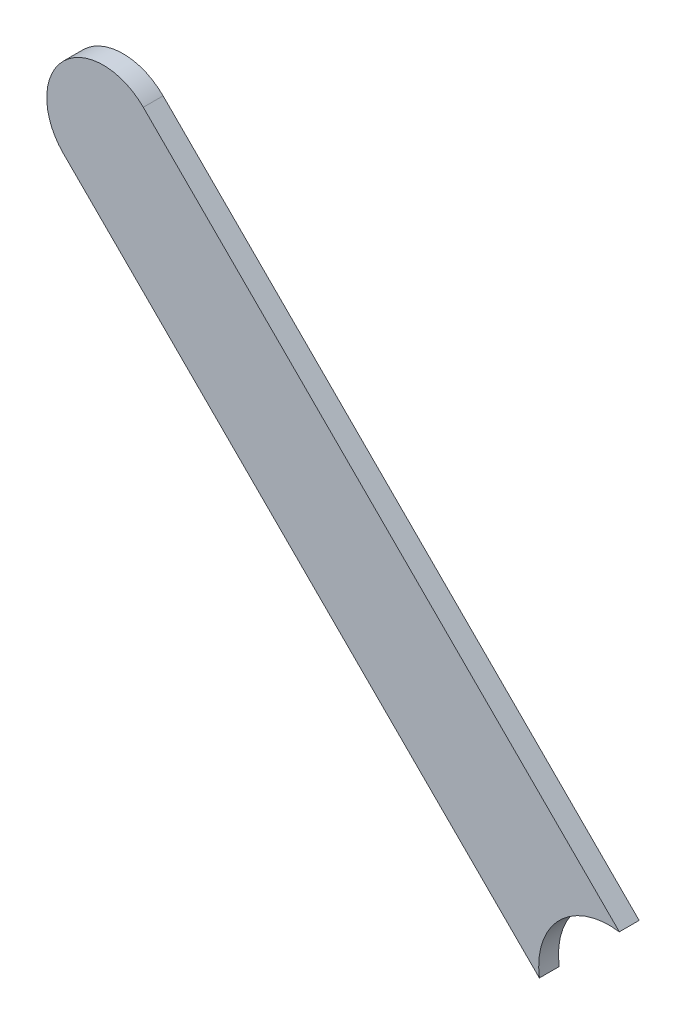
ISO-10303-21;
HEADER;
FILE_DESCRIPTION(('STEP AP214'),'2;1');
FILE_NAME('part.step','',(''),(''),'','','');
FILE_SCHEMA(('AUTOMOTIVE_DESIGN { 1 0 10303 214 1 1 1 1 }'));
ENDSEC;
DATA;
#1=APPLICATION_CONTEXT('core data for automotive mechanical design processes');
#2=APPLICATION_PROTOCOL_DEFINITION('international standard','automotive_design',2000,#1);
#3=PRODUCT_CONTEXT('',#1,'mechanical');
#4=PRODUCT('Part','Part','',(#3));
#5=PRODUCT_RELATED_PRODUCT_CATEGORY('part','',(#4));
#6=PRODUCT_DEFINITION_FORMATION('','',#4);
#7=PRODUCT_DEFINITION_CONTEXT('part definition',#1,'design');
#8=PRODUCT_DEFINITION('design','',#6,#7);
#9=PRODUCT_DEFINITION_SHAPE('','',#8);
#10=(LENGTH_UNIT() NAMED_UNIT(*) SI_UNIT(.MILLI.,.METRE.));
#11=(NAMED_UNIT(*) PLANE_ANGLE_UNIT() SI_UNIT($,.RADIAN.));
#12=(NAMED_UNIT(*) SI_UNIT($,.STERADIAN.) SOLID_ANGLE_UNIT());
#13=UNCERTAINTY_MEASURE_WITH_UNIT(LENGTH_MEASURE(1.E-05),#10,'distance_accuracy_value','');
#14=(GEOMETRIC_REPRESENTATION_CONTEXT(3) GLOBAL_UNCERTAINTY_ASSIGNED_CONTEXT((#13)) GLOBAL_UNIT_ASSIGNED_CONTEXT((#10,
#11,#12)) REPRESENTATION_CONTEXT('',''));
#15=CARTESIAN_POINT('',(0.,0.,0.));
#16=DIRECTION('',(0.,0.,1.));
#17=DIRECTION('',(1.,0.,0.));
#18=AXIS2_PLACEMENT_3D('',#15,#16,#17);
#19=CARTESIAN_POINT('',(94.899137,-127.365685,1.6));
#20=DIRECTION('',(0.707106781186548,0.707106781186548,0.));
#21=DIRECTION('',(0.,0.,-1.));
#22=AXIS2_PLACEMENT_3D('',#19,#20,#21);
#23=PLANE('',#22);
#24=DIRECTION('',(0.,0.,-1.));
#25=VECTOR('',#24,1.);
#26=CARTESIAN_POINT('',(95.74112925392,-128.2076772539,-0.045));
#27=LINE('',#26,#25);
#28=CARTESIAN_POINT('',(95.741129253912,-128.2076772539,1.635));
#29=VERTEX_POINT('',#28);
#30=CARTESIAN_POINT('',(95.741129253912,-128.2076772539,1.6));
#31=VERTEX_POINT('',#30);
#32=EDGE_CURVE('E11',#29,#31,#27,.T.);
#33=ORIENTED_EDGE('',*,*,#32,.F.);
#34=DIRECTION('',(0.707106781186548,-0.707106781186548,0.));
#35=VECTOR('',#34,1.);
#36=CARTESIAN_POINT('',(94.899137,-127.365685,1.635));
#37=LINE('',#36,#35);
#38=CARTESIAN_POINT('',(94.899137,-127.365685,1.635));
#39=VERTEX_POINT('',#38);
#40=EDGE_CURVE('E25',#39,#29,#37,.T.);
#41=ORIENTED_EDGE('',*,*,#40,.F.);
#42=DIRECTION('',(0.,0.,1.));
#43=VECTOR('',#42,1.);
#44=CARTESIAN_POINT('',(94.899137,-127.365685,1.6));
#45=LINE('',#44,#43);
#46=CARTESIAN_POINT('',(94.899137,-127.365685,1.6));
#47=VERTEX_POINT('',#46);
#48=EDGE_CURVE('E111',#47,#39,#45,.T.);
#49=ORIENTED_EDGE('',*,*,#48,.F.);
#50=DIRECTION('',(0.707106781186548,-0.707106781186548,0.));
#51=VECTOR('',#50,1.);
#52=CARTESIAN_POINT('',(94.899137,-127.365685,1.6));
#53=LINE('',#52,#51);
#54=EDGE_CURVE('E74',#47,#31,#53,.T.);
#55=ORIENTED_EDGE('',*,*,#54,.T.);
#56=EDGE_LOOP('',(#33,#41,#49,#55));
#57=FACE_BOUND('',#56,.T.);
#58=ADVANCED_FACE('F17',(#57),#23,.F.);
#59=CARTESIAN_POINT('',(95.864873,-128.19,-0.045));
#60=DIRECTION('',(0.,0.,-1.));
#61=DIRECTION('',(0.,-1.,0.));
#62=AXIS2_PLACEMENT_3D('',#59,#60,#61);
#63=CYLINDRICAL_SURFACE('',#62,0.125);
#64=DIRECTION('',(0.,0.,-1.));
#65=VECTOR('',#64,1.);
#66=CARTESIAN_POINT('',(95.88255025392,-128.0662562539,-0.045));
#67=LINE('',#66,#65);
#68=CARTESIAN_POINT('',(95.882550253931,-128.0662562539,1.635));
#69=VERTEX_POINT('',#68);
#70=CARTESIAN_POINT('',(95.882550253931,-128.0662562539,1.6));
#71=VERTEX_POINT('',#70);
#72=EDGE_CURVE('E87',#69,#71,#67,.T.);
#73=ORIENTED_EDGE('',*,*,#72,.F.);
#74=CARTESIAN_POINT('',(95.864873,-128.19,1.635));
#75=DIRECTION('',(0.,0.,-1.));
#76=DIRECTION('',(0.,-1.,0.));
#77=AXIS2_PLACEMENT_3D('',#74,#75,#76);
#78=CIRCLE('',#77,0.125);
#79=EDGE_CURVE('E108',#29,#69,#78,.T.);
#80=ORIENTED_EDGE('',*,*,#79,.F.);
#81=ORIENTED_EDGE('',*,*,#32,.T.);
#82=CARTESIAN_POINT('',(95.864873,-128.19,1.6));
#83=DIRECTION('',(0.,0.,-1.));
#84=DIRECTION('',(0.,-1.,0.));
#85=AXIS2_PLACEMENT_3D('',#82,#83,#84);
#86=CIRCLE('',#85,0.125);
#87=EDGE_CURVE('E79',#31,#71,#86,.T.);
#88=ORIENTED_EDGE('',*,*,#87,.T.);
#89=EDGE_LOOP('',(#73,#80,#81,#88));
#90=FACE_BOUND('',#89,.T.);
#91=ADVANCED_FACE('F122',(#90),#63,.F.);
#92=CARTESIAN_POINT('',(95.935583,-128.119289,1.635));
#93=DIRECTION('',(0.,0.,1.));
#94=DIRECTION('',(1.,0.,0.));
#95=AXIS2_PLACEMENT_3D('',#92,#93,#94);
#96=PLANE('',#95);
#97=ORIENTED_EDGE('',*,*,#79,.T.);
#98=DIRECTION('',(-0.707106781186548,0.707106781186548,0.));
#99=VECTOR('',#98,1.);
#100=CARTESIAN_POINT('',(95.935583,-128.119289,1.635));
#101=LINE('',#100,#99);
#102=CARTESIAN_POINT('',(95.040558,-127.224264,1.635));
#103=VERTEX_POINT('',#102);
#104=EDGE_CURVE('E94',#69,#103,#101,.T.);
#105=ORIENTED_EDGE('',*,*,#104,.T.);
#106=CARTESIAN_POINT('',(94.9698475,-127.2949745,1.635));
#107=DIRECTION('',(0.,0.,1.));
#108=DIRECTION('',(0.707106781187048,0.707106781186048,0.));
#109=AXIS2_PLACEMENT_3D('',#106,#107,#108);
#110=CIRCLE('',#109,0.09999974810218);
#111=EDGE_CURVE('E91',#103,#39,#110,.T.);
#112=ORIENTED_EDGE('',*,*,#111,.T.);
#113=ORIENTED_EDGE('',*,*,#40,.T.);
#114=EDGE_LOOP('',(#97,#105,#112,#113));
#115=FACE_BOUND('',#114,.T.);
#116=ADVANCED_FACE('F119',(#115),#96,.T.);
#117=CARTESIAN_POINT('',(94.9698475,-127.2949745,1.6));
#118=DIRECTION('',(0.,0.,-1.));
#119=DIRECTION('',(0.707106781187048,0.707106781186048,0.));
#120=AXIS2_PLACEMENT_3D('',#117,#118,#119);
#121=CYLINDRICAL_SURFACE('',#120,0.09999974810218);
#122=CARTESIAN_POINT('',(94.9698475,-127.2949745,1.6));
#123=DIRECTION('',(0.,0.,1.));
#124=DIRECTION('',(0.707106781187048,0.707106781186048,0.));
#125=AXIS2_PLACEMENT_3D('',#122,#123,#124);
#126=CIRCLE('',#125,0.09999974810218);
#127=CARTESIAN_POINT('',(95.040558,-127.224264,1.6));
#128=VERTEX_POINT('',#127);
#129=EDGE_CURVE('E68',#128,#47,#126,.T.);
#130=ORIENTED_EDGE('',*,*,#129,.T.);
#131=ORIENTED_EDGE('',*,*,#48,.T.);
#132=ORIENTED_EDGE('',*,*,#111,.F.);
#133=DIRECTION('',(0.,0.,1.));
#134=VECTOR('',#133,1.);
#135=CARTESIAN_POINT('',(95.040558,-127.224264,1.6));
#136=LINE('',#135,#134);
#137=EDGE_CURVE('E85',#128,#103,#136,.T.);
#138=ORIENTED_EDGE('',*,*,#137,.F.);
#139=EDGE_LOOP('',(#130,#131,#132,#138));
#140=FACE_BOUND('',#139,.T.);
#141=ADVANCED_FACE('F90',(#140),#121,.T.);
#142=CARTESIAN_POINT('',(95.935583,-128.119289,1.6));
#143=DIRECTION('',(0.,0.,1.));
#144=DIRECTION('',(1.,0.,0.));
#145=AXIS2_PLACEMENT_3D('',#142,#143,#144);
#146=PLANE('',#145);
#147=ORIENTED_EDGE('',*,*,#54,.F.);
#148=ORIENTED_EDGE('',*,*,#129,.F.);
#149=DIRECTION('',(-0.707106781186548,0.707106781186548,0.));
#150=VECTOR('',#149,1.);
#151=CARTESIAN_POINT('',(95.935583,-128.119289,1.6));
#152=LINE('',#151,#150);
#153=EDGE_CURVE('E72',#71,#128,#152,.T.);
#154=ORIENTED_EDGE('',*,*,#153,.F.);
#155=ORIENTED_EDGE('',*,*,#87,.F.);
#156=EDGE_LOOP('',(#147,#148,#154,#155));
#157=FACE_BOUND('',#156,.T.);
#158=ADVANCED_FACE('F70',(#157),#146,.F.);
#159=CARTESIAN_POINT('',(95.935583,-128.119289,1.6));
#160=DIRECTION('',(-0.707106781186548,-0.707106781186548,0.));
#161=DIRECTION('',(-0.707106781186548,0.707106781186548,0.));
#162=AXIS2_PLACEMENT_3D('',#159,#160,#161);
#163=PLANE('',#162);
#164=ORIENTED_EDGE('',*,*,#137,.T.);
#165=ORIENTED_EDGE('',*,*,#104,.F.);
#166=ORIENTED_EDGE('',*,*,#72,.T.);
#167=ORIENTED_EDGE('',*,*,#153,.T.);
#168=EDGE_LOOP('',(#164,#165,#166,#167));
#169=FACE_BOUND('',#168,.T.);
#170=ADVANCED_FACE('F83',(#169),#163,.F.);
#171=CLOSED_SHELL('',(#58,#91,#116,#141,#158,#170));
#172=MANIFOLD_SOLID_BREP('B1',#171);
#173=ADVANCED_BREP_SHAPE_REPRESENTATION('',(#18,#172),#14);
#174=SHAPE_DEFINITION_REPRESENTATION(#9,#173);
ENDSEC;
END-ISO-10303-21;
